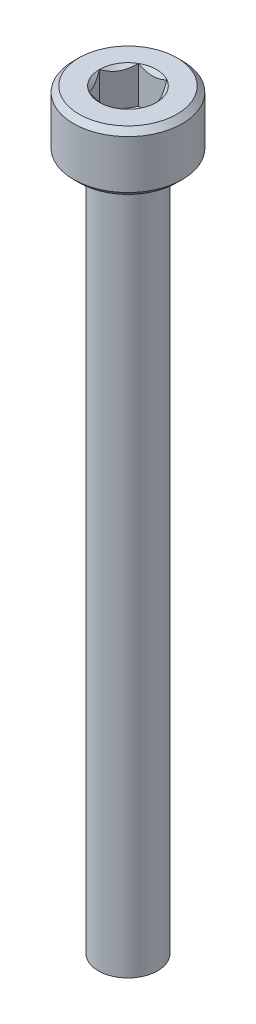
ISO-10303-21;
HEADER;
FILE_DESCRIPTION(('STEP AP214'),'2;1');
FILE_NAME('part.step','',(''),(''),'','','');
FILE_SCHEMA(('AUTOMOTIVE_DESIGN { 1 0 10303 214 1 1 1 1 }'));
ENDSEC;
DATA;
#1=APPLICATION_CONTEXT('core data for automotive mechanical design processes');
#2=APPLICATION_PROTOCOL_DEFINITION('international standard','automotive_design',2000,#1);
#3=PRODUCT_CONTEXT('',#1,'mechanical');
#4=PRODUCT('Part','Part','',(#3));
#5=PRODUCT_RELATED_PRODUCT_CATEGORY('part','',(#4));
#6=PRODUCT_DEFINITION_FORMATION('','',#4);
#7=PRODUCT_DEFINITION_CONTEXT('part definition',#1,'design');
#8=PRODUCT_DEFINITION('design','',#6,#7);
#9=PRODUCT_DEFINITION_SHAPE('','',#8);
#10=(LENGTH_UNIT() NAMED_UNIT(*) SI_UNIT(.MILLI.,.METRE.));
#11=(NAMED_UNIT(*) PLANE_ANGLE_UNIT() SI_UNIT($,.RADIAN.));
#12=(NAMED_UNIT(*) SI_UNIT($,.STERADIAN.) SOLID_ANGLE_UNIT());
#13=UNCERTAINTY_MEASURE_WITH_UNIT(LENGTH_MEASURE(1.E-05),#10,'distance_accuracy_value','');
#14=(GEOMETRIC_REPRESENTATION_CONTEXT(3) GLOBAL_UNCERTAINTY_ASSIGNED_CONTEXT((#13)) GLOBAL_UNIT_ASSIGNED_CONTEXT((#10,
#11,#12)) REPRESENTATION_CONTEXT('',''));
#15=CARTESIAN_POINT('',(0.,0.,0.));
#16=DIRECTION('',(0.,0.,1.));
#17=DIRECTION('',(1.,0.,0.));
#18=AXIS2_PLACEMENT_3D('',#15,#16,#17);
#19=CARTESIAN_POINT('',(0.,3.,0.));
#20=DIRECTION('',(0.,-1.,0.));
#21=DIRECTION('',(0.,0.,-1.));
#22=AXIS2_PLACEMENT_3D('',#19,#20,#21);
#23=CYLINDRICAL_SURFACE('',#22,2.75);
#24=CARTESIAN_POINT('',(0.,0.275000000000001,0.));
#25=DIRECTION('',(0.,1.,0.));
#26=DIRECTION('',(0.,0.,1.));
#27=AXIS2_PLACEMENT_3D('',#24,#25,#26);
#28=CIRCLE('',#27,2.75);
#29=CARTESIAN_POINT('',(0.,0.275000000000001,2.75));
#30=VERTEX_POINT('',#29);
#31=EDGE_CURVE('E222',#30,#30,#28,.T.);
#32=ORIENTED_EDGE('',*,*,#31,.T.);
#33=EDGE_LOOP('',(#32));
#34=FACE_BOUND('',#33,.T.);
#35=CARTESIAN_POINT('',(0.,2.725,0.));
#36=DIRECTION('',(0.,1.,0.));
#37=DIRECTION('',(0.,0.,1.));
#38=AXIS2_PLACEMENT_3D('',#35,#36,#37);
#39=CIRCLE('',#38,2.75);
#40=CARTESIAN_POINT('',(0.,2.725,2.75));
#41=VERTEX_POINT('',#40);
#42=EDGE_CURVE('E105',#41,#41,#39,.F.);
#43=ORIENTED_EDGE('',*,*,#42,.T.);
#44=EDGE_LOOP('',(#43));
#45=FACE_BOUND('',#44,.T.);
#46=ADVANCED_FACE('F33',(#34,#45),#23,.T.);
#47=CARTESIAN_POINT('',(0.,3.,0.));
#48=DIRECTION('',(0.,1.,0.));
#49=DIRECTION('',(0.,0.,1.));
#50=AXIS2_PLACEMENT_3D('',#47,#48,#49);
#51=PLANE('',#50);
#52=CARTESIAN_POINT('',(0.,3.,0.));
#53=DIRECTION('',(0.,1.,0.));
#54=DIRECTION('',(0.,0.,1.));
#55=AXIS2_PLACEMENT_3D('',#52,#53,#54);
#56=CIRCLE('',#55,2.475);
#57=CARTESIAN_POINT('',(0.,3.,2.475));
#58=VERTEX_POINT('',#57);
#59=EDGE_CURVE('E37',#58,#58,#56,.T.);
#60=ORIENTED_EDGE('',*,*,#59,.T.);
#61=EDGE_LOOP('',(#60));
#62=FACE_BOUND('',#61,.T.);
#63=CARTESIAN_POINT('',(0.,3.,0.));
#64=DIRECTION('',(0.,1.,0.));
#65=DIRECTION('',(0.,0.,1.));
#66=AXIS2_PLACEMENT_3D('',#63,#64,#65);
#67=CIRCLE('',#66,1.44337567297406);
#68=CARTESIAN_POINT('',(0.721687836487033,3.,1.25));
#69=VERTEX_POINT('',#68);
#70=CARTESIAN_POINT('',(1.44337567297406,3.,0.));
#71=VERTEX_POINT('',#70);
#72=EDGE_CURVE('E48',#69,#71,#67,.T.);
#73=ORIENTED_EDGE('',*,*,#72,.F.);
#74=CARTESIAN_POINT('',(-0.721687836487033,3.,1.25));
#75=VERTEX_POINT('',#74);
#76=EDGE_CURVE('E55',#75,#69,#67,.T.);
#77=ORIENTED_EDGE('',*,*,#76,.F.);
#78=CARTESIAN_POINT('',(-1.44337567297406,3.,0.));
#79=VERTEX_POINT('',#78);
#80=EDGE_CURVE('E128',#79,#75,#67,.T.);
#81=ORIENTED_EDGE('',*,*,#80,.F.);
#82=CARTESIAN_POINT('',(-0.721687836487033,3.,-1.25));
#83=VERTEX_POINT('',#82);
#84=EDGE_CURVE('E127',#83,#79,#67,.T.);
#85=ORIENTED_EDGE('',*,*,#84,.F.);
#86=CARTESIAN_POINT('',(0.721687836487032,3.,-1.25));
#87=VERTEX_POINT('',#86);
#88=EDGE_CURVE('E95',#87,#83,#67,.T.);
#89=ORIENTED_EDGE('',*,*,#88,.F.);
#90=EDGE_CURVE('E87',#71,#87,#67,.T.);
#91=ORIENTED_EDGE('',*,*,#90,.F.);
#92=EDGE_LOOP('',(#73,#77,#81,#85,#89,#91));
#93=FACE_BOUND('',#92,.T.);
#94=ADVANCED_FACE('F125',(#62,#93),#51,.T.);
#95=CARTESIAN_POINT('',(0.,0.,0.));
#96=DIRECTION('',(0.,1.,0.));
#97=DIRECTION('',(0.,0.,1.));
#98=AXIS2_PLACEMENT_3D('',#95,#96,#97);
#99=PLANE('',#98);
#100=CARTESIAN_POINT('',(0.,0.,0.));
#101=DIRECTION('',(0.,-1.,0.));
#102=DIRECTION('',(0.,0.,-1.));
#103=AXIS2_PLACEMENT_3D('',#100,#101,#102);
#104=CIRCLE('',#103,1.5);
#105=CARTESIAN_POINT('',(0.,0.,-1.5));
#106=VERTEX_POINT('',#105);
#107=EDGE_CURVE('E11',#106,#106,#104,.T.);
#108=ORIENTED_EDGE('',*,*,#107,.F.);
#109=EDGE_LOOP('',(#108));
#110=FACE_BOUND('',#109,.T.);
#111=CARTESIAN_POINT('',(0.,0.,0.));
#112=DIRECTION('',(0.,1.,0.));
#113=DIRECTION('',(0.,0.,1.));
#114=AXIS2_PLACEMENT_3D('',#111,#112,#113);
#115=CIRCLE('',#114,2.475);
#116=CARTESIAN_POINT('',(0.,0.,2.475));
#117=VERTEX_POINT('',#116);
#118=EDGE_CURVE('E220',#117,#117,#115,.F.);
#119=ORIENTED_EDGE('',*,*,#118,.T.);
#120=EDGE_LOOP('',(#119));
#121=FACE_BOUND('',#120,.T.);
#122=ADVANCED_FACE('F203',(#110,#121),#99,.F.);
#123=CARTESIAN_POINT('',(0.,3.,0.));
#124=DIRECTION('',(0.,1.,0.));
#125=DIRECTION('',(0.,0.,1.));
#126=AXIS2_PLACEMENT_3D('',#123,#124,#125);
#127=CONICAL_SURFACE('',#126,1.44337567297406,0.78539816339745);
#128=ORIENTED_EDGE('',*,*,#88,.T.);
#129=CARTESIAN_POINT('',(-1.43934010808077,3.46298209689233,-1.25));
#130=CARTESIAN_POINT('',(-1.40429313005659,3.43652492263289,-1.25));
#131=CARTESIAN_POINT('',(-1.36905087135599,3.41032716035428,-1.25));
#132=CARTESIAN_POINT('',(-1.29809650706311,3.35855757183958,-1.25));
#133=CARTESIAN_POINT('',(-1.26238428576495,3.33298590435629,-1.25));
#134=CARTESIAN_POINT('',(-1.15390111792708,3.25700599368946,-1.25));
#135=CARTESIAN_POINT('',(-1.08031646726264,3.20774028618957,-1.25));
#136=CARTESIAN_POINT('',(-0.926012322755095,3.11102583026313,-1.25));
#137=CARTESIAN_POINT('',(-0.845125318656146,3.0638412989418,-1.25));
#138=CARTESIAN_POINT('',(-0.679311174076602,2.97753073439041,-1.25));
#139=CARTESIAN_POINT('',(-0.594398891026688,2.9383775346269,-1.25));
#140=CARTESIAN_POINT('',(-0.466944812460741,2.89047722368829,-1.25));
#141=CARTESIAN_POINT('',(-0.426289985812822,2.87672948978634,-1.25));
#142=CARTESIAN_POINT('',(-0.343998850091268,2.85249792745054,-1.25));
#143=CARTESIAN_POINT('',(-0.302362473614962,2.84201432386977,-1.25));
#144=CARTESIAN_POINT('',(-0.219052696285666,2.8250301617483,-1.25));
#145=CARTESIAN_POINT('',(-0.1773934284745,2.81846136047137,-1.25));
#146=CARTESIAN_POINT('',(-0.0936293693401924,2.80943505345776,-1.25));
#147=CARTESIAN_POINT('',(-0.0515246558543963,2.80697684099727,-1.25));
#148=CARTESIAN_POINT('',(0.0311890576306314,2.80635406201328,-1.25));
#149=CARTESIAN_POINT('',(0.0717969625499302,2.80803711684625,-1.25));
#150=CARTESIAN_POINT('',(0.152668636885197,2.81526827059791,-1.25));
#151=CARTESIAN_POINT('',(0.192932338835358,2.82081711041311,-1.25));
#152=CARTESIAN_POINT('',(0.273499879165295,2.83557103646495,-1.25));
#153=CARTESIAN_POINT('',(0.313792180618511,2.8448381759641,-1.25));
#154=CARTESIAN_POINT('',(0.393496413911457,2.86653617845735,-1.25));
#155=CARTESIAN_POINT('',(0.432908419115059,2.87896677673064,-1.25));
#156=CARTESIAN_POINT('',(0.556992735862298,2.92277935293144,-1.25));
#157=CARTESIAN_POINT('',(0.639898924666085,2.95915107287596,-1.25));
#158=CARTESIAN_POINT('',(0.801816555499701,3.04001916217833,-1.25));
#159=CARTESIAN_POINT('',(0.880812666325045,3.08454472091199,-1.25));
#160=CARTESIAN_POINT('',(1.0317856127975,3.17640487666662,-1.25));
#161=CARTESIAN_POINT('',(1.10391618485086,3.22348993391625,-1.25));
#162=CARTESIAN_POINT('',(1.21018606043311,3.29627856159854,-1.25));
#163=CARTESIAN_POINT('',(1.24515069969379,3.32079808539336,-1.25));
#164=CARTESIAN_POINT('',(1.31460220852736,3.37048563676568,-1.25));
#165=CARTESIAN_POINT('',(1.34908920596618,3.39565348541552,-1.25));
#166=CARTESIAN_POINT('',(1.38337731682912,3.42109014884121,-1.25));
#167=B_SPLINE_CURVE_WITH_KNOTS('',3,(#129,#130,#131,#132,#133,#134,#135,#136,#137,#138,#139,
#140,#141,#142,#143,#144,#145,#146,#147,#148,#149,#150,#151,#152,#153,#154,#155,#156,#157,#158,
#159,#160,#161,#162,#163,#164,#165,#166),.UNSPECIFIED.,.F.,.F.,(4,2,2,2,2,2,2,2,2,2,2,2,2,2,2,2,
2,2,4),(0.,0.131732960381448,0.263498984161645,0.529042014455825,0.809741926134617,
1.08947609717225,1.21811634272576,1.346765447839,1.47310084517844,1.59941451973784,
1.72115042167849,1.84290966131735,1.96679153905341,2.09066305366039,2.36146692896009,
2.63325989198491,2.89154668212279,3.01965734507713,3.14773302245628),.UNSPECIFIED.);
#168=EDGE_CURVE('E100',#87,#83,#167,.F.);
#169=ORIENTED_EDGE('',*,*,#168,.F.);
#170=EDGE_LOOP('',(#128,#169));
#171=FACE_BOUND('',#170,.T.);
#172=ADVANCED_FACE('F101',(#171),#127,.F.);
#173=ORIENTED_EDGE('',*,*,#84,.T.);
#174=CARTESIAN_POINT('',(-0.721572366433195,3.00011548390914,-1.2502));
#175=CARTESIAN_POINT('',(-0.746384090710444,2.9753216680551,-1.20722483292841));
#176=CARTESIAN_POINT('',(-0.771610739653664,2.95198373441868,-1.16353099525405));
#177=CARTESIAN_POINT('',(-0.823050873919155,2.90925200408454,-1.07443406915806));
#178=CARTESIAN_POINT('',(-0.849269254648333,2.88988199236041,-1.02902250164294));
#179=CARTESIAN_POINT('',(-0.902137405038635,2.85670048341348,-0.937452179064741));
#180=CARTESIAN_POINT('',(-0.928773701756387,2.84280555905266,-0.891316759824115));
#181=CARTESIAN_POINT('',(-0.982632884076012,2.82139728216064,-0.798029919592408));
#182=CARTESIAN_POINT('',(-1.00985412292348,2.81386794156679,-0.750881350863621));
#183=CARTESIAN_POINT('',(-1.05676666578643,2.8070744980507,-0.669626443112748));
#184=CARTESIAN_POINT('',(-1.07639733689152,2.80606855910435,-0.63562512337206));
#185=CARTESIAN_POINT('',(-1.11562418145499,2.80776141491132,-0.567682235567523));
#186=CARTESIAN_POINT('',(-1.1352203463451,2.81046102721554,-0.533740682344343));
#187=CARTESIAN_POINT('',(-1.1742235548576,2.81940893031638,-0.466185143542501));
#188=CARTESIAN_POINT('',(-1.19363040521233,2.82566052589971,-0.432571492713226));
#189=CARTESIAN_POINT('',(-1.23212011385119,2.8413756814139,-0.365905361782188));
#190=CARTESIAN_POINT('',(-1.2512028293628,2.85084062008746,-0.332853128969705));
#191=CARTESIAN_POINT('',(-1.30007715810653,2.87893139068759,-0.248200308399736));
#192=CARTESIAN_POINT('',(-1.32956058931202,2.8996701574522,-0.197133507570362));
#193=CARTESIAN_POINT('',(-1.38737318998519,2.94638713467148,-0.0969991458867452));
#194=CARTESIAN_POINT('',(-1.41570576386268,2.97234829594677,-0.0479256884217304));
#195=CARTESIAN_POINT('',(-1.4434911430279,3.00011548390914,0.000200000000000358));
#196=B_SPLINE_CURVE_WITH_KNOTS('',3,(#174,#175,#176,#177,#178,#179,#180,#181,#182,#183,#184,
#185,#186,#187,#188,#189,#190,#191,#192,#193,#194,#195),.UNSPECIFIED.,.F.,.F.,(4,2,2,2,2,2,2,2,
2,2,4),(0.,0.166533409618303,0.334037607289761,0.498880396489697,0.663307919240274,
0.780963963458826,0.898645970148452,1.01643764860773,1.13427993171549,1.32148652032141,
1.50809158792574),.UNSPECIFIED.);
#197=EDGE_CURVE('E130',#83,#79,#196,.T.);
#198=ORIENTED_EDGE('',*,*,#197,.F.);
#199=EDGE_LOOP('',(#173,#198));
#200=FACE_BOUND('',#199,.T.);
#201=ADVANCED_FACE('F237',(#200),#127,.F.);
#202=ORIENTED_EDGE('',*,*,#80,.T.);
#203=CARTESIAN_POINT('',(-1.4434911430279,3.00011548390914,-0.000199999999999785));
#204=CARTESIAN_POINT('',(-1.41867941875065,2.9753216680551,0.0427751670715869));
#205=CARTESIAN_POINT('',(-1.39345276980743,2.95198373441868,0.0864690047459481));
#206=CARTESIAN_POINT('',(-1.34201263554194,2.90925200408454,0.175565930841942));
#207=CARTESIAN_POINT('',(-1.31579425481276,2.88988199236041,0.220977498357064));
#208=CARTESIAN_POINT('',(-1.26292610442246,2.85670048341348,0.31254782093526));
#209=CARTESIAN_POINT('',(-1.23628980770471,2.84280555905266,0.358683240175886));
#210=CARTESIAN_POINT('',(-1.18243062538508,2.82139728216064,0.451970080407593));
#211=CARTESIAN_POINT('',(-1.15520938653761,2.81386794156679,0.49911864913638));
#212=CARTESIAN_POINT('',(-1.10829684367467,2.8070744980507,0.580373556887253));
#213=CARTESIAN_POINT('',(-1.08866617256958,2.80606855910435,0.614374876627941));
#214=CARTESIAN_POINT('',(-1.04943932800611,2.80776141491132,0.682317764432478));
#215=CARTESIAN_POINT('',(-1.02984316311599,2.81046102721554,0.716259317655658));
#216=CARTESIAN_POINT('',(-0.990839954603499,2.81940893031638,0.7838148564575));
#217=CARTESIAN_POINT('',(-0.971433104248771,2.82566052589971,0.817428507286775));
#218=CARTESIAN_POINT('',(-0.932943395609905,2.8413756814139,0.884094638217813));
#219=CARTESIAN_POINT('',(-0.9138606800983,2.85084062008746,0.917146871030296));
#220=CARTESIAN_POINT('',(-0.864986351354568,2.87893139068759,1.00179969160026));
#221=CARTESIAN_POINT('',(-0.835502920149076,2.8996701574522,1.05286649242964));
#222=CARTESIAN_POINT('',(-0.777690319475909,2.94638713467148,1.15300085411325));
#223=CARTESIAN_POINT('',(-0.749357745598417,2.97234829594677,1.20207431157827));
#224=CARTESIAN_POINT('',(-0.721572366433195,3.00011548390914,1.2502));
#225=B_SPLINE_CURVE_WITH_KNOTS('',3,(#203,#204,#205,#206,#207,#208,#209,#210,#211,#212,#213,
#214,#215,#216,#217,#218,#219,#220,#221,#222,#223,#224),.UNSPECIFIED.,.F.,.F.,(4,2,2,2,2,2,2,2,
2,2,4),(0.,0.166533409618303,0.334037607289761,0.498880396489698,0.663307919240275,
0.780963963458827,0.898645970148453,1.01643764860773,1.1342799317155,1.32148652032141,
1.50809158792573),.UNSPECIFIED.);
#226=EDGE_CURVE('E139',#79,#75,#225,.T.);
#227=ORIENTED_EDGE('',*,*,#226,.F.);
#228=EDGE_LOOP('',(#202,#227));
#229=FACE_BOUND('',#228,.T.);
#230=ADVANCED_FACE('F252',(#229),#127,.F.);
#231=ORIENTED_EDGE('',*,*,#76,.T.);
#232=CARTESIAN_POINT('',(-1.43934010808077,3.46298209689233,1.25));
#233=CARTESIAN_POINT('',(-1.40429313005659,3.43652492263289,1.25));
#234=CARTESIAN_POINT('',(-1.36905087135599,3.41032716035428,1.25));
#235=CARTESIAN_POINT('',(-1.29809650706311,3.35855757183958,1.25));
#236=CARTESIAN_POINT('',(-1.26238428576495,3.33298590435629,1.25));
#237=CARTESIAN_POINT('',(-1.15390111792708,3.25700599368946,1.25));
#238=CARTESIAN_POINT('',(-1.08031646726264,3.20774028618957,1.25));
#239=CARTESIAN_POINT('',(-0.926012322755096,3.11102583026313,1.25));
#240=CARTESIAN_POINT('',(-0.845125318656147,3.0638412989418,1.25));
#241=CARTESIAN_POINT('',(-0.679311174076603,2.97753073439041,1.25));
#242=CARTESIAN_POINT('',(-0.594398891026688,2.9383775346269,1.25));
#243=CARTESIAN_POINT('',(-0.46694481246074,2.89047722368829,1.25));
#244=CARTESIAN_POINT('',(-0.426289985812822,2.87672948978634,1.25));
#245=CARTESIAN_POINT('',(-0.343998850091268,2.85249792745054,1.25));
#246=CARTESIAN_POINT('',(-0.302362473614962,2.84201432386977,1.25));
#247=CARTESIAN_POINT('',(-0.219052696285665,2.8250301617483,1.25));
#248=CARTESIAN_POINT('',(-0.1773934284745,2.81846136047137,1.25));
#249=CARTESIAN_POINT('',(-0.0936293693401921,2.80943505345776,1.25));
#250=CARTESIAN_POINT('',(-0.051524655854396,2.80697684099727,1.25));
#251=CARTESIAN_POINT('',(0.0311890576306315,2.80635406201328,1.25));
#252=CARTESIAN_POINT('',(0.0717969625499303,2.80803711684625,1.25));
#253=CARTESIAN_POINT('',(0.152668636885197,2.81526827059791,1.25));
#254=CARTESIAN_POINT('',(0.192932338835358,2.82081711041311,1.25));
#255=CARTESIAN_POINT('',(0.273499879165295,2.83557103646495,1.25));
#256=CARTESIAN_POINT('',(0.313792180618511,2.8448381759641,1.25));
#257=CARTESIAN_POINT('',(0.393496413911457,2.86653617845735,1.25));
#258=CARTESIAN_POINT('',(0.432908419115059,2.87896677673064,1.25));
#259=CARTESIAN_POINT('',(0.556992735862298,2.92277935293144,1.25));
#260=CARTESIAN_POINT('',(0.639898924666085,2.95915107287595,1.25));
#261=CARTESIAN_POINT('',(0.801816555499701,3.04001916217833,1.25));
#262=CARTESIAN_POINT('',(0.880812666325044,3.08454472091198,1.25));
#263=CARTESIAN_POINT('',(1.0317856127975,3.17640487666662,1.25));
#264=CARTESIAN_POINT('',(1.10391618485086,3.22348993391625,1.25));
#265=CARTESIAN_POINT('',(1.2101860604331,3.29627856159854,1.25));
#266=CARTESIAN_POINT('',(1.24515069969379,3.32079808539336,1.25));
#267=CARTESIAN_POINT('',(1.31460220852736,3.37048563676568,1.25));
#268=CARTESIAN_POINT('',(1.34908920596618,3.39565348541552,1.25));
#269=CARTESIAN_POINT('',(1.38337731682911,3.42109014884121,1.25));
#270=B_SPLINE_CURVE_WITH_KNOTS('',3,(#232,#233,#234,#235,#236,#237,#238,#239,#240,#241,#242,
#243,#244,#245,#246,#247,#248,#249,#250,#251,#252,#253,#254,#255,#256,#257,#258,#259,#260,#261,
#262,#263,#264,#265,#266,#267,#268,#269),.UNSPECIFIED.,.F.,.F.,(4,2,2,2,2,2,2,2,2,2,2,2,2,2,2,2,
2,2,4),(0.,0.131732960381448,0.263498984161645,0.529042014455826,0.809741926134619,
1.08947609717225,1.21811634272577,1.34676544783901,1.47310084517844,1.59941451973785,
1.7211504216785,1.84290966131735,1.96679153905342,2.09066305366039,2.36146692896009,
2.63325989198491,2.89154668212279,3.01965734507713,3.14773302245628),.UNSPECIFIED.);
#271=EDGE_CURVE('E166',#75,#69,#270,.T.);
#272=ORIENTED_EDGE('',*,*,#271,.F.);
#273=EDGE_LOOP('',(#231,#272));
#274=FACE_BOUND('',#273,.T.);
#275=ADVANCED_FACE('F282',(#274),#127,.F.);
#276=ORIENTED_EDGE('',*,*,#72,.T.);
#277=CARTESIAN_POINT('',(0.721572366433194,3.00011548390914,1.2502));
#278=CARTESIAN_POINT('',(0.746384090710444,2.9753216680551,1.20722483292841));
#279=CARTESIAN_POINT('',(0.771610739653664,2.95198373441868,1.16353099525405));
#280=CARTESIAN_POINT('',(0.823050873919154,2.90925200408454,1.07443406915806));
#281=CARTESIAN_POINT('',(0.849269254648333,2.88988199236041,1.02902250164294));
#282=CARTESIAN_POINT('',(0.902137405038635,2.85670048341348,0.93745217906474));
#283=CARTESIAN_POINT('',(0.928773701756386,2.84280555905266,0.891316759824115));
#284=CARTESIAN_POINT('',(0.982632884076012,2.82139728216064,0.798029919592408));
#285=CARTESIAN_POINT('',(1.00985412292348,2.81386794156679,0.750881350863621));
#286=CARTESIAN_POINT('',(1.05676666578643,2.8070744980507,0.669626443112748));
#287=CARTESIAN_POINT('',(1.07639733689152,2.80606855910435,0.63562512337206));
#288=CARTESIAN_POINT('',(1.11562418145499,2.80776141491132,0.567682235567523));
#289=CARTESIAN_POINT('',(1.1352203463451,2.81046102721554,0.533740682344343));
#290=CARTESIAN_POINT('',(1.1742235548576,2.81940893031638,0.466185143542501));
#291=CARTESIAN_POINT('',(1.19363040521232,2.8256605258997,0.432571492713226));
#292=CARTESIAN_POINT('',(1.23212011385119,2.8413756814139,0.365905361782188));
#293=CARTESIAN_POINT('',(1.2512028293628,2.85084062008746,0.332853128969705));
#294=CARTESIAN_POINT('',(1.30007715810653,2.87893139068759,0.248200308399736));
#295=CARTESIAN_POINT('',(1.32956058931202,2.8996701574522,0.197133507570362));
#296=CARTESIAN_POINT('',(1.38737318998519,2.94638713467148,0.096999145886745));
#297=CARTESIAN_POINT('',(1.41570576386268,2.97234829594677,0.04792568842173));
#298=CARTESIAN_POINT('',(1.4434911430279,3.00011548390914,-0.000200000000000782));
#299=B_SPLINE_CURVE_WITH_KNOTS('',3,(#277,#278,#279,#280,#281,#282,#283,#284,#285,#286,#287,
#288,#289,#290,#291,#292,#293,#294,#295,#296,#297,#298),.UNSPECIFIED.,.F.,.F.,(4,2,2,2,2,2,2,2,
2,2,4),(0.,0.166533409618303,0.334037607289761,0.498880396489697,0.663307919240274,
0.780963963458826,0.898645970148452,1.01643764860773,1.13427993171549,1.32148652032141,
1.50809158792574),.UNSPECIFIED.);
#300=EDGE_CURVE('E115',#69,#71,#299,.T.);
#301=ORIENTED_EDGE('',*,*,#300,.F.);
#302=EDGE_LOOP('',(#276,#301));
#303=FACE_BOUND('',#302,.T.);
#304=ADVANCED_FACE('F153',(#303),#127,.F.);
#305=ORIENTED_EDGE('',*,*,#90,.T.);
#306=CARTESIAN_POINT('',(1.4434911430279,3.00011548390914,0.000199999999999333));
#307=CARTESIAN_POINT('',(1.41867941875065,2.9753216680551,-0.0427751670715874));
#308=CARTESIAN_POINT('',(1.39345276980743,2.95198373441868,-0.0864690047459486));
#309=CARTESIAN_POINT('',(1.34201263554194,2.90925200408454,-0.175565930841942));
#310=CARTESIAN_POINT('',(1.31579425481276,2.88988199236041,-0.220977498357064));
#311=CARTESIAN_POINT('',(1.26292610442246,2.85670048341348,-0.31254782093526));
#312=CARTESIAN_POINT('',(1.23628980770471,2.84280555905266,-0.358683240175886));
#313=CARTESIAN_POINT('',(1.18243062538508,2.82139728216064,-0.451970080407593));
#314=CARTESIAN_POINT('',(1.15520938653761,2.81386794156679,-0.49911864913638));
#315=CARTESIAN_POINT('',(1.10829684367467,2.8070744980507,-0.580373556887252));
#316=CARTESIAN_POINT('',(1.08866617256958,2.80606855910435,-0.614374876627941));
#317=CARTESIAN_POINT('',(1.04943932800611,2.80776141491132,-0.682317764432477));
#318=CARTESIAN_POINT('',(1.02984316311599,2.81046102721554,-0.716259317655657));
#319=CARTESIAN_POINT('',(0.990839954603499,2.81940893031638,-0.783814856457499));
#320=CARTESIAN_POINT('',(0.971433104248771,2.82566052589971,-0.817428507286775));
#321=CARTESIAN_POINT('',(0.932943395609905,2.8413756814139,-0.884094638217813));
#322=CARTESIAN_POINT('',(0.9138606800983,2.85084062008746,-0.917146871030295));
#323=CARTESIAN_POINT('',(0.864986351354567,2.87893139068759,-1.00179969160026));
#324=CARTESIAN_POINT('',(0.835502920149075,2.8996701574522,-1.05286649242964));
#325=CARTESIAN_POINT('',(0.777690319475908,2.94638713467148,-1.15300085411326));
#326=CARTESIAN_POINT('',(0.749357745598416,2.97234829594677,-1.20207431157827));
#327=CARTESIAN_POINT('',(0.721572366433194,3.00011548390914,-1.2502));
#328=B_SPLINE_CURVE_WITH_KNOTS('',3,(#306,#307,#308,#309,#310,#311,#312,#313,#314,#315,#316,
#317,#318,#319,#320,#321,#322,#323,#324,#325,#326,#327),.UNSPECIFIED.,.F.,.F.,(4,2,2,2,2,2,2,2,
2,2,4),(0.,0.166533409618303,0.334037607289761,0.498880396489698,0.663307919240274,
0.780963963458826,0.898645970148452,1.01643764860773,1.13427993171549,1.32148652032141,
1.50809158792574),.UNSPECIFIED.);
#329=EDGE_CURVE('E91',#71,#87,#328,.T.);
#330=ORIENTED_EDGE('',*,*,#329,.F.);
#331=EDGE_LOOP('',(#305,#330));
#332=FACE_BOUND('',#331,.T.);
#333=ADVANCED_FACE('F89',(#332),#127,.F.);
#334=CARTESIAN_POINT('',(0.,1.12,0.));
#335=DIRECTION('',(0.,1.,0.));
#336=DIRECTION('',(0.,0.,1.));
#337=AXIS2_PLACEMENT_3D('',#334,#335,#336);
#338=PLANE('',#337);
#339=DIRECTION('',(-0.5,0.,-0.866025403784438));
#340=VECTOR('',#339,1.);
#341=CARTESIAN_POINT('',(1.44337567297406,1.12,0.));
#342=LINE('',#341,#340);
#343=CARTESIAN_POINT('',(1.44337567297406,1.12,0.));
#344=VERTEX_POINT('',#343);
#345=CARTESIAN_POINT('',(0.721687836487032,1.12,-1.25));
#346=VERTEX_POINT('',#345);
#347=EDGE_CURVE('E114',#344,#346,#342,.T.);
#348=ORIENTED_EDGE('',*,*,#347,.T.);
#349=DIRECTION('',(-1.,0.,0.));
#350=VECTOR('',#349,1.);
#351=CARTESIAN_POINT('',(0.721687836487032,1.12,-1.25));
#352=LINE('',#351,#350);
#353=CARTESIAN_POINT('',(-0.721687836487032,1.12,-1.25));
#354=VERTEX_POINT('',#353);
#355=EDGE_CURVE('E119',#346,#354,#352,.T.);
#356=ORIENTED_EDGE('',*,*,#355,.T.);
#357=DIRECTION('',(-0.5,0.,0.866025403784439));
#358=VECTOR('',#357,1.);
#359=CARTESIAN_POINT('',(-0.721687836487032,1.12,-1.25));
#360=LINE('',#359,#358);
#361=CARTESIAN_POINT('',(-1.44337567297406,1.12,0.));
#362=VERTEX_POINT('',#361);
#363=EDGE_CURVE('E276',#354,#362,#360,.T.);
#364=ORIENTED_EDGE('',*,*,#363,.T.);
#365=DIRECTION('',(0.5,0.,0.866025403784439));
#366=VECTOR('',#365,1.);
#367=CARTESIAN_POINT('',(-1.44337567297406,1.12,0.));
#368=LINE('',#367,#366);
#369=CARTESIAN_POINT('',(-0.721687836487033,1.12,1.25));
#370=VERTEX_POINT('',#369);
#371=EDGE_CURVE('E259',#362,#370,#368,.T.);
#372=ORIENTED_EDGE('',*,*,#371,.T.);
#373=DIRECTION('',(1.,0.,0.));
#374=VECTOR('',#373,1.);
#375=CARTESIAN_POINT('',(-0.721687836487033,1.12,1.25));
#376=LINE('',#375,#374);
#377=CARTESIAN_POINT('',(0.721687836487032,1.12,1.25));
#378=VERTEX_POINT('',#377);
#379=EDGE_CURVE('E272',#370,#378,#376,.T.);
#380=ORIENTED_EDGE('',*,*,#379,.T.);
#381=DIRECTION('',(0.5,0.,-0.866025403784439));
#382=VECTOR('',#381,1.);
#383=CARTESIAN_POINT('',(0.721687836487032,1.12,1.25));
#384=LINE('',#383,#382);
#385=EDGE_CURVE('E122',#378,#344,#384,.T.);
#386=ORIENTED_EDGE('',*,*,#385,.T.);
#387=EDGE_LOOP('',(#348,#356,#364,#372,#380,#386));
#388=FACE_BOUND('',#387,.T.);
#389=ADVANCED_FACE('F152',(#388),#338,.T.);
#390=CARTESIAN_POINT('',(0.721687836487032,1.12,-1.25));
#391=DIRECTION('',(0.,0.,-1.));
#392=DIRECTION('',(-1.,0.,0.));
#393=AXIS2_PLACEMENT_3D('',#390,#391,#392);
#394=PLANE('',#393);
#395=DIRECTION('',(0.,1.,0.));
#396=VECTOR('',#395,1.);
#397=CARTESIAN_POINT('',(0.721687836487032,1.12,-1.25));
#398=LINE('',#397,#396);
#399=EDGE_CURVE('E112',#346,#87,#398,.T.);
#400=ORIENTED_EDGE('',*,*,#399,.T.);
#401=ORIENTED_EDGE('',*,*,#168,.T.);
#402=DIRECTION('',(0.,1.,0.));
#403=VECTOR('',#402,1.);
#404=CARTESIAN_POINT('',(-0.721687836487032,1.12,-1.25));
#405=LINE('',#404,#403);
#406=EDGE_CURVE('E121',#354,#83,#405,.T.);
#407=ORIENTED_EDGE('',*,*,#406,.F.);
#408=ORIENTED_EDGE('',*,*,#355,.F.);
#409=EDGE_LOOP('',(#400,#401,#407,#408));
#410=FACE_BOUND('',#409,.T.);
#411=ADVANCED_FACE('F117',(#410),#394,.F.);
#412=CARTESIAN_POINT('',(-0.721687836487032,1.12,-1.25));
#413=DIRECTION('',(-0.866025403784439,0.,-0.5));
#414=DIRECTION('',(-0.5,0.,0.866025403784439));
#415=AXIS2_PLACEMENT_3D('',#412,#413,#414);
#416=PLANE('',#415);
#417=ORIENTED_EDGE('',*,*,#406,.T.);
#418=ORIENTED_EDGE('',*,*,#197,.T.);
#419=DIRECTION('',(0.,1.,0.));
#420=VECTOR('',#419,1.);
#421=CARTESIAN_POINT('',(-1.44337567297406,1.12,0.));
#422=LINE('',#421,#420);
#423=EDGE_CURVE('E255',#362,#79,#422,.T.);
#424=ORIENTED_EDGE('',*,*,#423,.F.);
#425=ORIENTED_EDGE('',*,*,#363,.F.);
#426=EDGE_LOOP('',(#417,#418,#424,#425));
#427=FACE_BOUND('',#426,.T.);
#428=ADVANCED_FACE('F145',(#427),#416,.F.);
#429=CARTESIAN_POINT('',(-1.44337567297406,1.12,0.));
#430=DIRECTION('',(-0.866025403784439,0.,0.5));
#431=DIRECTION('',(0.5,0.,0.866025403784439));
#432=AXIS2_PLACEMENT_3D('',#429,#430,#431);
#433=PLANE('',#432);
#434=ORIENTED_EDGE('',*,*,#423,.T.);
#435=ORIENTED_EDGE('',*,*,#226,.T.);
#436=DIRECTION('',(0.,1.,0.));
#437=VECTOR('',#436,1.);
#438=CARTESIAN_POINT('',(-0.721687836487033,1.12,1.25));
#439=LINE('',#438,#437);
#440=EDGE_CURVE('E261',#370,#75,#439,.T.);
#441=ORIENTED_EDGE('',*,*,#440,.F.);
#442=ORIENTED_EDGE('',*,*,#371,.F.);
#443=EDGE_LOOP('',(#434,#435,#441,#442));
#444=FACE_BOUND('',#443,.T.);
#445=ADVANCED_FACE('F187',(#444),#433,.F.);
#446=CARTESIAN_POINT('',(-0.721687836487033,1.12,1.25));
#447=DIRECTION('',(0.,0.,1.));
#448=DIRECTION('',(1.,0.,0.));
#449=AXIS2_PLACEMENT_3D('',#446,#447,#448);
#450=PLANE('',#449);
#451=ORIENTED_EDGE('',*,*,#440,.T.);
#452=ORIENTED_EDGE('',*,*,#271,.T.);
#453=DIRECTION('',(0.,1.,0.));
#454=VECTOR('',#453,1.);
#455=CARTESIAN_POINT('',(0.721687836487032,1.12,1.25));
#456=LINE('',#455,#454);
#457=EDGE_CURVE('E263',#378,#69,#456,.T.);
#458=ORIENTED_EDGE('',*,*,#457,.F.);
#459=ORIENTED_EDGE('',*,*,#379,.F.);
#460=EDGE_LOOP('',(#451,#452,#458,#459));
#461=FACE_BOUND('',#460,.T.);
#462=ADVANCED_FACE('F183',(#461),#450,.F.);
#463=CARTESIAN_POINT('',(0.721687836487032,1.12,1.25));
#464=DIRECTION('',(0.866025403784439,0.,0.5));
#465=DIRECTION('',(0.5,0.,-0.866025403784439));
#466=AXIS2_PLACEMENT_3D('',#463,#464,#465);
#467=PLANE('',#466);
#468=ORIENTED_EDGE('',*,*,#457,.T.);
#469=ORIENTED_EDGE('',*,*,#300,.T.);
#470=DIRECTION('',(0.,1.,0.));
#471=VECTOR('',#470,1.);
#472=CARTESIAN_POINT('',(1.44337567297406,1.12,0.));
#473=LINE('',#472,#471);
#474=EDGE_CURVE('E106',#344,#71,#473,.T.);
#475=ORIENTED_EDGE('',*,*,#474,.F.);
#476=ORIENTED_EDGE('',*,*,#385,.F.);
#477=EDGE_LOOP('',(#468,#469,#475,#476));
#478=FACE_BOUND('',#477,.T.);
#479=ADVANCED_FACE('F180',(#478),#467,.F.);
#480=CARTESIAN_POINT('',(1.44337567297406,1.12,0.));
#481=DIRECTION('',(0.866025403784438,0.,-0.5));
#482=DIRECTION('',(-0.5,0.,-0.866025403784439));
#483=AXIS2_PLACEMENT_3D('',#480,#481,#482);
#484=PLANE('',#483);
#485=ORIENTED_EDGE('',*,*,#474,.T.);
#486=ORIENTED_EDGE('',*,*,#329,.T.);
#487=ORIENTED_EDGE('',*,*,#399,.F.);
#488=ORIENTED_EDGE('',*,*,#347,.F.);
#489=EDGE_LOOP('',(#485,#486,#487,#488));
#490=FACE_BOUND('',#489,.T.);
#491=ADVANCED_FACE('F110',(#490),#484,.F.);
#492=CARTESIAN_POINT('',(0.,0.275000000000001,0.));
#493=DIRECTION('',(0.,1.,0.));
#494=DIRECTION('',(0.,0.,1.));
#495=AXIS2_PLACEMENT_3D('',#492,#493,#494);
#496=CONICAL_SURFACE('',#495,2.75,0.785398163397451);
#497=ORIENTED_EDGE('',*,*,#118,.F.);
#498=EDGE_LOOP('',(#497));
#499=FACE_BOUND('',#498,.T.);
#500=ORIENTED_EDGE('',*,*,#31,.F.);
#501=EDGE_LOOP('',(#500));
#502=FACE_BOUND('',#501,.T.);
#503=ADVANCED_FACE('F209',(#499,#502),#496,.T.);
#504=CARTESIAN_POINT('',(0.,3.,0.));
#505=DIRECTION('',(0.,-1.,0.));
#506=DIRECTION('',(0.,0.,-1.));
#507=AXIS2_PLACEMENT_3D('',#504,#505,#506);
#508=CONICAL_SURFACE('',#507,2.475,0.785398163397447);
#509=ORIENTED_EDGE('',*,*,#42,.F.);
#510=EDGE_LOOP('',(#509));
#511=FACE_BOUND('',#510,.T.);
#512=ORIENTED_EDGE('',*,*,#59,.F.);
#513=EDGE_LOOP('',(#512));
#514=FACE_BOUND('',#513,.T.);
#515=ADVANCED_FACE('F35',(#511,#514),#508,.T.);
#516=CARTESIAN_POINT('',(0.,-35.,0.));
#517=DIRECTION('',(0.,1.,0.));
#518=DIRECTION('',(0.,0.,1.));
#519=AXIS2_PLACEMENT_3D('',#516,#517,#518);
#520=CYLINDRICAL_SURFACE('',#519,1.5);
#521=CARTESIAN_POINT('',(0.,-35.,0.));
#522=DIRECTION('',(0.,-1.,0.));
#523=DIRECTION('',(0.,0.,-1.));
#524=AXIS2_PLACEMENT_3D('',#521,#522,#523);
#525=CIRCLE('',#524,1.5);
#526=CARTESIAN_POINT('',(0.,-35.,-1.5));
#527=VERTEX_POINT('',#526);
#528=EDGE_CURVE('E248',#527,#527,#525,.T.);
#529=ORIENTED_EDGE('',*,*,#528,.F.);
#530=EDGE_LOOP('',(#529));
#531=FACE_BOUND('',#530,.T.);
#532=ORIENTED_EDGE('',*,*,#107,.T.);
#533=EDGE_LOOP('',(#532));
#534=FACE_BOUND('',#533,.T.);
#535=ADVANCED_FACE('F154',(#531,#534),#520,.T.);
#536=CARTESIAN_POINT('',(0.,-35.,0.));
#537=DIRECTION('',(0.,-1.,0.));
#538=DIRECTION('',(0.,0.,-1.));
#539=AXIS2_PLACEMENT_3D('',#536,#537,#538);
#540=PLANE('',#539);
#541=ORIENTED_EDGE('',*,*,#528,.T.);
#542=EDGE_LOOP('',(#541));
#543=FACE_BOUND('',#542,.T.);
#544=ADVANCED_FACE('F241',(#543),#540,.T.);
#545=CLOSED_SHELL('',(#46,#94,#122,#172,#201,#230,#275,#304,#333,#389,#411,#428,#445,#462,#479,
#491,#503,#515,#535,#544));
#546=MANIFOLD_SOLID_BREP('B2',#545);
#547=ADVANCED_BREP_SHAPE_REPRESENTATION('',(#18,#546),#14);
#548=SHAPE_DEFINITION_REPRESENTATION(#9,#547);
ENDSEC;
END-ISO-10303-21;
